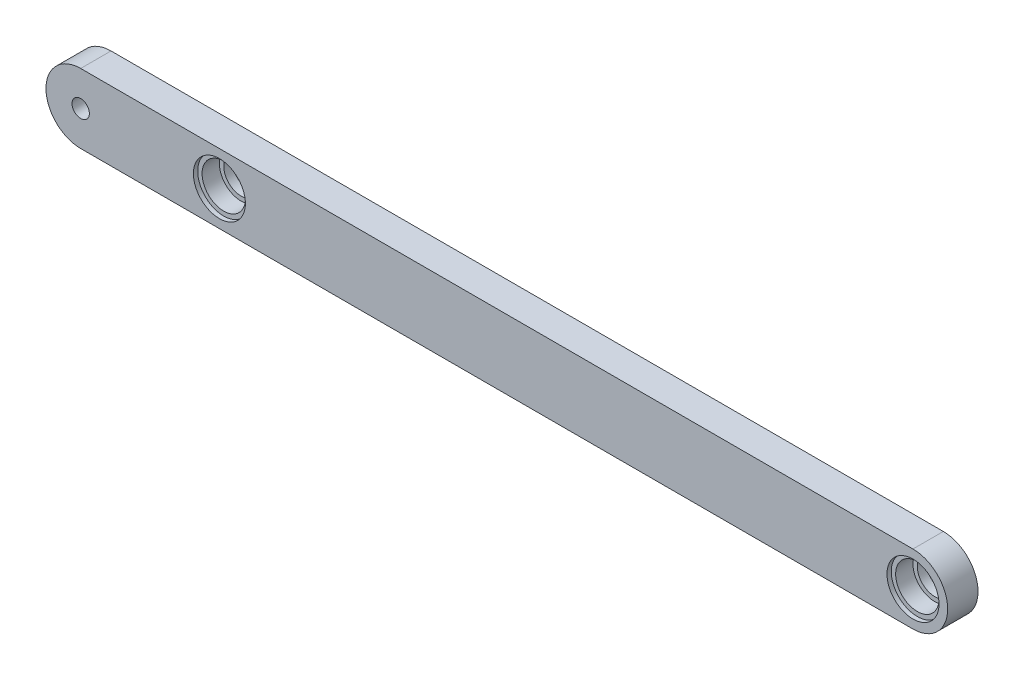
ISO-10303-21;
HEADER;
FILE_DESCRIPTION(('STEP AP214'),'2;1');
FILE_NAME('part.step','',(''),(''),'','','');
FILE_SCHEMA(('AUTOMOTIVE_DESIGN { 1 0 10303 214 1 1 1 1 }'));
ENDSEC;
DATA;
#1=APPLICATION_CONTEXT('core data for automotive mechanical design processes');
#2=APPLICATION_PROTOCOL_DEFINITION('international standard','automotive_design',2000,#1);
#3=PRODUCT_CONTEXT('',#1,'mechanical');
#4=PRODUCT('Part','Part','',(#3));
#5=PRODUCT_RELATED_PRODUCT_CATEGORY('part','',(#4));
#6=PRODUCT_DEFINITION_FORMATION('','',#4);
#7=PRODUCT_DEFINITION_CONTEXT('part definition',#1,'design');
#8=PRODUCT_DEFINITION('design','',#6,#7);
#9=PRODUCT_DEFINITION_SHAPE('','',#8);
#10=(LENGTH_UNIT() NAMED_UNIT(*) SI_UNIT(.MILLI.,.METRE.));
#11=(NAMED_UNIT(*) PLANE_ANGLE_UNIT() SI_UNIT($,.RADIAN.));
#12=(NAMED_UNIT(*) SI_UNIT($,.STERADIAN.) SOLID_ANGLE_UNIT());
#13=UNCERTAINTY_MEASURE_WITH_UNIT(LENGTH_MEASURE(1.E-05),#10,'distance_accuracy_value','');
#14=(GEOMETRIC_REPRESENTATION_CONTEXT(3) GLOBAL_UNCERTAINTY_ASSIGNED_CONTEXT((#13)) GLOBAL_UNIT_ASSIGNED_CONTEXT((#10,
#11,#12)) REPRESENTATION_CONTEXT('',''));
#15=CARTESIAN_POINT('',(0.,0.,0.));
#16=DIRECTION('',(0.,0.,1.));
#17=DIRECTION('',(1.,0.,0.));
#18=AXIS2_PLACEMENT_3D('',#15,#16,#17);
#19=CARTESIAN_POINT('',(0.,4.,3.5));
#20=DIRECTION('',(0.,-1.,0.));
#21=DIRECTION('',(1.,0.,0.));
#22=AXIS2_PLACEMENT_3D('',#19,#20,#21);
#23=PLANE('',#22);
#24=DIRECTION('',(0.,0.,1.));
#25=VECTOR('',#24,1.);
#26=CARTESIAN_POINT('',(3.99999999999999,4.00000000000001,0.));
#27=LINE('',#26,#25);
#28=CARTESIAN_POINT('',(3.99999999999999,4.,0.));
#29=VERTEX_POINT('',#28);
#30=CARTESIAN_POINT('',(3.99999999999999,4.00000000000001,3.5));
#31=VERTEX_POINT('',#30);
#32=EDGE_CURVE('E48',#29,#31,#27,.T.);
#33=ORIENTED_EDGE('',*,*,#32,.T.);
#34=DIRECTION('',(-1.,0.,0.));
#35=VECTOR('',#34,1.);
#36=CARTESIAN_POINT('',(0.,4.,3.5));
#37=LINE('',#36,#35);
#38=CARTESIAN_POINT('',(100.,4.00000000000001,3.5));
#39=VERTEX_POINT('',#38);
#40=EDGE_CURVE('E82',#39,#31,#37,.T.);
#41=ORIENTED_EDGE('',*,*,#40,.F.);
#42=DIRECTION('',(0.,0.,-1.));
#43=VECTOR('',#42,1.);
#44=CARTESIAN_POINT('',(100.,4.00000000000001,3.5));
#45=LINE('',#44,#43);
#46=CARTESIAN_POINT('',(100.,4.00000000000001,0.));
#47=VERTEX_POINT('',#46);
#48=EDGE_CURVE('E41',#39,#47,#45,.T.);
#49=ORIENTED_EDGE('',*,*,#48,.T.);
#50=DIRECTION('',(-1.,0.,0.));
#51=VECTOR('',#50,1.);
#52=CARTESIAN_POINT('',(0.,4.,0.));
#53=LINE('',#52,#51);
#54=EDGE_CURVE('E77',#47,#29,#53,.T.);
#55=ORIENTED_EDGE('',*,*,#54,.T.);
#56=EDGE_LOOP('',(#33,#41,#49,#55));
#57=FACE_BOUND('',#56,.T.);
#58=ADVANCED_FACE('F33',(#57),#23,.F.);
#59=CARTESIAN_POINT('',(20.,0.,1.));
#60=DIRECTION('',(0.,0.,1.));
#61=DIRECTION('',(1.,0.,0.));
#62=AXIS2_PLACEMENT_3D('',#59,#60,#61);
#63=CYLINDRICAL_SURFACE('',#62,2.5);
#64=CARTESIAN_POINT('',(20.,0.,1.));
#65=DIRECTION('',(0.,0.,1.));
#66=DIRECTION('',(1.,0.,0.));
#67=AXIS2_PLACEMENT_3D('',#64,#65,#66);
#68=CIRCLE('',#67,2.5);
#69=CARTESIAN_POINT('',(22.5,0.,1.));
#70=VERTEX_POINT('',#69);
#71=EDGE_CURVE('E116',#70,#70,#68,.T.);
#72=ORIENTED_EDGE('',*,*,#71,.F.);
#73=EDGE_LOOP('',(#72));
#74=FACE_BOUND('',#73,.T.);
#75=CARTESIAN_POINT('',(20.,0.,3.));
#76=DIRECTION('',(0.,0.,1.));
#77=DIRECTION('',(1.,0.,0.));
#78=AXIS2_PLACEMENT_3D('',#75,#76,#77);
#79=CIRCLE('',#78,2.5);
#80=CARTESIAN_POINT('',(22.5,0.,3.));
#81=VERTEX_POINT('',#80);
#82=EDGE_CURVE('E119',#81,#81,#79,.T.);
#83=ORIENTED_EDGE('',*,*,#82,.T.);
#84=EDGE_LOOP('',(#83));
#85=FACE_BOUND('',#84,.T.);
#86=ADVANCED_FACE('F173',(#74,#85),#63,.F.);
#87=CARTESIAN_POINT('',(20.,0.,0.));
#88=DIRECTION('',(0.,0.,1.));
#89=DIRECTION('',(1.,0.,0.));
#90=AXIS2_PLACEMENT_3D('',#87,#88,#89);
#91=CYLINDRICAL_SURFACE('',#90,2.);
#92=CARTESIAN_POINT('',(20.,0.,0.));
#93=DIRECTION('',(0.,0.,1.));
#94=DIRECTION('',(1.,0.,0.));
#95=AXIS2_PLACEMENT_3D('',#92,#93,#94);
#96=CIRCLE('',#95,2.);
#97=CARTESIAN_POINT('',(22.,0.,0.));
#98=VERTEX_POINT('',#97);
#99=EDGE_CURVE('E106',#98,#98,#96,.T.);
#100=ORIENTED_EDGE('',*,*,#99,.F.);
#101=EDGE_LOOP('',(#100));
#102=FACE_BOUND('',#101,.T.);
#103=CARTESIAN_POINT('',(20.,0.,1.));
#104=DIRECTION('',(0.,0.,1.));
#105=DIRECTION('',(1.,0.,0.));
#106=AXIS2_PLACEMENT_3D('',#103,#104,#105);
#107=CIRCLE('',#106,2.);
#108=CARTESIAN_POINT('',(22.,0.,1.));
#109=VERTEX_POINT('',#108);
#110=EDGE_CURVE('E113',#109,#109,#107,.T.);
#111=ORIENTED_EDGE('',*,*,#110,.T.);
#112=EDGE_LOOP('',(#111));
#113=FACE_BOUND('',#112,.T.);
#114=ADVANCED_FACE('F178',(#102,#113),#91,.F.);
#115=CARTESIAN_POINT('',(100.,0.,1.));
#116=DIRECTION('',(0.,0.,1.));
#117=DIRECTION('',(1.,0.,0.));
#118=AXIS2_PLACEMENT_3D('',#115,#116,#117);
#119=CYLINDRICAL_SURFACE('',#118,2.50000000000001);
#120=CARTESIAN_POINT('',(100.,0.,1.));
#121=DIRECTION('',(0.,0.,1.));
#122=DIRECTION('',(1.,0.,0.));
#123=AXIS2_PLACEMENT_3D('',#120,#121,#122);
#124=CIRCLE('',#123,2.50000000000001);
#125=CARTESIAN_POINT('',(102.5,0.,1.));
#126=VERTEX_POINT('',#125);
#127=EDGE_CURVE('E95',#126,#126,#124,.T.);
#128=ORIENTED_EDGE('',*,*,#127,.F.);
#129=EDGE_LOOP('',(#128));
#130=FACE_BOUND('',#129,.T.);
#131=CARTESIAN_POINT('',(100.,0.,3.));
#132=DIRECTION('',(0.,0.,1.));
#133=DIRECTION('',(1.,0.,0.));
#134=AXIS2_PLACEMENT_3D('',#131,#132,#133);
#135=CIRCLE('',#134,2.50000000000001);
#136=CARTESIAN_POINT('',(102.5,0.,3.));
#137=VERTEX_POINT('',#136);
#138=EDGE_CURVE('E105',#137,#137,#135,.T.);
#139=ORIENTED_EDGE('',*,*,#138,.T.);
#140=EDGE_LOOP('',(#139));
#141=FACE_BOUND('',#140,.T.);
#142=ADVANCED_FACE('F191',(#130,#141),#119,.F.);
#143=CARTESIAN_POINT('',(100.,0.,0.));
#144=DIRECTION('',(0.,0.,1.));
#145=DIRECTION('',(1.,0.,0.));
#146=AXIS2_PLACEMENT_3D('',#143,#144,#145);
#147=CYLINDRICAL_SURFACE('',#146,2.);
#148=CARTESIAN_POINT('',(100.,0.,0.));
#149=DIRECTION('',(0.,0.,1.));
#150=DIRECTION('',(1.,0.,0.));
#151=AXIS2_PLACEMENT_3D('',#148,#149,#150);
#152=CIRCLE('',#151,2.);
#153=CARTESIAN_POINT('',(102.,0.,0.));
#154=VERTEX_POINT('',#153);
#155=EDGE_CURVE('E90',#154,#154,#152,.T.);
#156=ORIENTED_EDGE('',*,*,#155,.F.);
#157=EDGE_LOOP('',(#156));
#158=FACE_BOUND('',#157,.T.);
#159=CARTESIAN_POINT('',(100.,0.,1.));
#160=DIRECTION('',(0.,0.,1.));
#161=DIRECTION('',(1.,0.,0.));
#162=AXIS2_PLACEMENT_3D('',#159,#160,#161);
#163=CIRCLE('',#162,2.);
#164=CARTESIAN_POINT('',(102.,0.,1.));
#165=VERTEX_POINT('',#164);
#166=EDGE_CURVE('E98',#165,#165,#163,.T.);
#167=ORIENTED_EDGE('',*,*,#166,.T.);
#168=EDGE_LOOP('',(#167));
#169=FACE_BOUND('',#168,.T.);
#170=ADVANCED_FACE('F186',(#158,#169),#147,.F.);
#171=CARTESIAN_POINT('',(0.,-4.,3.5));
#172=DIRECTION('',(0.,1.,0.));
#173=DIRECTION('',(-1.,0.,0.));
#174=AXIS2_PLACEMENT_3D('',#171,#172,#173);
#175=PLANE('',#174);
#176=DIRECTION('',(1.,0.,0.));
#177=VECTOR('',#176,1.);
#178=CARTESIAN_POINT('',(0.,-4.,3.5));
#179=LINE('',#178,#177);
#180=CARTESIAN_POINT('',(3.99999999999999,-4.00000000000001,3.5));
#181=VERTEX_POINT('',#180);
#182=CARTESIAN_POINT('',(100.,-4.00000000000001,3.5));
#183=VERTEX_POINT('',#182);
#184=EDGE_CURVE('E85',#181,#183,#179,.T.);
#185=ORIENTED_EDGE('',*,*,#184,.F.);
#186=DIRECTION('',(0.,0.,1.));
#187=VECTOR('',#186,1.);
#188=CARTESIAN_POINT('',(3.99999999999999,-4.00000000000001,0.));
#189=LINE('',#188,#187);
#190=CARTESIAN_POINT('',(3.99999999999999,-4.00000000000001,0.));
#191=VERTEX_POINT('',#190);
#192=EDGE_CURVE('E134',#191,#181,#189,.T.);
#193=ORIENTED_EDGE('',*,*,#192,.F.);
#194=DIRECTION('',(1.,0.,0.));
#195=VECTOR('',#194,1.);
#196=CARTESIAN_POINT('',(0.,-4.,0.));
#197=LINE('',#196,#195);
#198=CARTESIAN_POINT('',(100.,-4.00000000000001,0.));
#199=VERTEX_POINT('',#198);
#200=EDGE_CURVE('E78',#191,#199,#197,.T.);
#201=ORIENTED_EDGE('',*,*,#200,.T.);
#202=DIRECTION('',(0.,0.,-1.));
#203=VECTOR('',#202,1.);
#204=CARTESIAN_POINT('',(100.,-4.00000000000001,3.5));
#205=LINE('',#204,#203);
#206=EDGE_CURVE('E11',#183,#199,#205,.T.);
#207=ORIENTED_EDGE('',*,*,#206,.F.);
#208=EDGE_LOOP('',(#185,#193,#201,#207));
#209=FACE_BOUND('',#208,.T.);
#210=ADVANCED_FACE('F35',(#209),#175,.F.);
#211=CARTESIAN_POINT('',(100.,0.,3.5));
#212=DIRECTION('',(0.,0.,-1.));
#213=DIRECTION('',(-1.,0.,0.));
#214=AXIS2_PLACEMENT_3D('',#211,#212,#213);
#215=CYLINDRICAL_SURFACE('',#214,4.00000000000001);
#216=CARTESIAN_POINT('',(100.,0.,0.));
#217=DIRECTION('',(0.,0.,1.));
#218=DIRECTION('',(1.,0.,0.));
#219=AXIS2_PLACEMENT_3D('',#216,#217,#218);
#220=CIRCLE('',#219,4.00000000000001);
#221=EDGE_CURVE('E69',#199,#47,#220,.T.);
#222=ORIENTED_EDGE('',*,*,#221,.T.);
#223=ORIENTED_EDGE('',*,*,#48,.F.);
#224=CARTESIAN_POINT('',(100.,0.,3.5));
#225=DIRECTION('',(0.,0.,1.));
#226=DIRECTION('',(1.,0.,0.));
#227=AXIS2_PLACEMENT_3D('',#224,#225,#226);
#228=CIRCLE('',#227,4.00000000000001);
#229=EDGE_CURVE('E57',#183,#39,#228,.T.);
#230=ORIENTED_EDGE('',*,*,#229,.F.);
#231=ORIENTED_EDGE('',*,*,#206,.T.);
#232=EDGE_LOOP('',(#222,#223,#230,#231));
#233=FACE_BOUND('',#232,.T.);
#234=ADVANCED_FACE('F71',(#233),#215,.T.);
#235=CARTESIAN_POINT('',(0.,0.,3.5));
#236=DIRECTION('',(0.,0.,1.));
#237=DIRECTION('',(1.,0.,0.));
#238=AXIS2_PLACEMENT_3D('',#235,#236,#237);
#239=PLANE('',#238);
#240=CARTESIAN_POINT('',(3.99999999999999,0.,3.5));
#241=DIRECTION('',(0.,0.,-1.));
#242=DIRECTION('',(1.,0.,0.));
#243=AXIS2_PLACEMENT_3D('',#240,#241,#242);
#244=CIRCLE('',#243,4.00000000000001);
#245=EDGE_CURVE('E138',#181,#31,#244,.T.);
#246=ORIENTED_EDGE('',*,*,#245,.F.);
#247=ORIENTED_EDGE('',*,*,#184,.T.);
#248=ORIENTED_EDGE('',*,*,#229,.T.);
#249=ORIENTED_EDGE('',*,*,#40,.T.);
#250=EDGE_LOOP('',(#246,#247,#248,#249));
#251=FACE_BOUND('',#250,.T.);
#252=CARTESIAN_POINT('',(3.99999999999999,0.,3.5));
#253=DIRECTION('',(0.,0.,1.));
#254=DIRECTION('',(1.,0.,0.));
#255=AXIS2_PLACEMENT_3D('',#252,#253,#254);
#256=CIRCLE('',#255,1.);
#257=CARTESIAN_POINT('',(4.99999999999999,0.,3.5));
#258=VERTEX_POINT('',#257);
#259=EDGE_CURVE('E129',#258,#258,#256,.T.);
#260=ORIENTED_EDGE('',*,*,#259,.F.);
#261=EDGE_LOOP('',(#260));
#262=FACE_BOUND('',#261,.T.);
#263=CARTESIAN_POINT('',(20.,0.,3.5));
#264=DIRECTION('',(0.,0.,1.));
#265=DIRECTION('',(1.,0.,0.));
#266=AXIS2_PLACEMENT_3D('',#263,#264,#265);
#267=CIRCLE('',#266,3.);
#268=CARTESIAN_POINT('',(23.,0.,3.5));
#269=VERTEX_POINT('',#268);
#270=EDGE_CURVE('E120',#269,#269,#267,.T.);
#271=ORIENTED_EDGE('',*,*,#270,.F.);
#272=EDGE_LOOP('',(#271));
#273=FACE_BOUND('',#272,.T.);
#274=CARTESIAN_POINT('',(100.,0.,3.5));
#275=DIRECTION('',(0.,0.,1.));
#276=DIRECTION('',(1.,0.,0.));
#277=AXIS2_PLACEMENT_3D('',#274,#275,#276);
#278=CIRCLE('',#277,3.00000000000001);
#279=CARTESIAN_POINT('',(103.,0.,3.5));
#280=VERTEX_POINT('',#279);
#281=EDGE_CURVE('E102',#280,#280,#278,.T.);
#282=ORIENTED_EDGE('',*,*,#281,.F.);
#283=EDGE_LOOP('',(#282));
#284=FACE_BOUND('',#283,.T.);
#285=ADVANCED_FACE('F146',(#251,#262,#273,#284),#239,.T.);
#286=CARTESIAN_POINT('',(0.,0.,0.));
#287=DIRECTION('',(0.,0.,1.));
#288=DIRECTION('',(1.,0.,0.));
#289=AXIS2_PLACEMENT_3D('',#286,#287,#288);
#290=PLANE('',#289);
#291=CARTESIAN_POINT('',(3.99999999999999,0.,0.));
#292=DIRECTION('',(0.,0.,1.));
#293=DIRECTION('',(1.,0.,0.));
#294=AXIS2_PLACEMENT_3D('',#291,#292,#293);
#295=CIRCLE('',#294,1.);
#296=CARTESIAN_POINT('',(4.99999999999999,0.,0.));
#297=VERTEX_POINT('',#296);
#298=EDGE_CURVE('E124',#297,#297,#295,.T.);
#299=ORIENTED_EDGE('',*,*,#298,.T.);
#300=EDGE_LOOP('',(#299));
#301=FACE_BOUND('',#300,.T.);
#302=ORIENTED_EDGE('',*,*,#99,.T.);
#303=EDGE_LOOP('',(#302));
#304=FACE_BOUND('',#303,.T.);
#305=ORIENTED_EDGE('',*,*,#155,.T.);
#306=EDGE_LOOP('',(#305));
#307=FACE_BOUND('',#306,.T.);
#308=ORIENTED_EDGE('',*,*,#200,.F.);
#309=CARTESIAN_POINT('',(3.99999999999999,0.,0.));
#310=DIRECTION('',(0.,0.,-1.));
#311=DIRECTION('',(1.,0.,0.));
#312=AXIS2_PLACEMENT_3D('',#309,#310,#311);
#313=CIRCLE('',#312,4.00000000000001);
#314=EDGE_CURVE('E84',#191,#29,#313,.T.);
#315=ORIENTED_EDGE('',*,*,#314,.T.);
#316=ORIENTED_EDGE('',*,*,#54,.F.);
#317=ORIENTED_EDGE('',*,*,#221,.F.);
#318=EDGE_LOOP('',(#308,#315,#316,#317));
#319=FACE_BOUND('',#318,.T.);
#320=ADVANCED_FACE('F83',(#301,#304,#307,#319),#290,.F.);
#321=CARTESIAN_POINT('',(0.,0.,1.));
#322=DIRECTION('',(0.,0.,1.));
#323=DIRECTION('',(1.,0.,0.));
#324=AXIS2_PLACEMENT_3D('',#321,#322,#323);
#325=PLANE('',#324);
#326=ORIENTED_EDGE('',*,*,#166,.F.);
#327=EDGE_LOOP('',(#326));
#328=FACE_BOUND('',#327,.T.);
#329=ORIENTED_EDGE('',*,*,#127,.T.);
#330=EDGE_LOOP('',(#329));
#331=FACE_BOUND('',#330,.T.);
#332=ADVANCED_FACE('F159',(#328,#331),#325,.T.);
#333=CARTESIAN_POINT('',(100.,0.,3.));
#334=DIRECTION('',(0.,0.,1.));
#335=DIRECTION('',(1.,0.,0.));
#336=AXIS2_PLACEMENT_3D('',#333,#334,#335);
#337=CYLINDRICAL_SURFACE('',#336,3.00000000000001);
#338=CARTESIAN_POINT('',(100.,0.,3.));
#339=DIRECTION('',(0.,0.,1.));
#340=DIRECTION('',(1.,0.,0.));
#341=AXIS2_PLACEMENT_3D('',#338,#339,#340);
#342=CIRCLE('',#341,3.00000000000001);
#343=CARTESIAN_POINT('',(103.,0.,3.));
#344=VERTEX_POINT('',#343);
#345=EDGE_CURVE('E101',#344,#344,#342,.T.);
#346=ORIENTED_EDGE('',*,*,#345,.F.);
#347=EDGE_LOOP('',(#346));
#348=FACE_BOUND('',#347,.T.);
#349=ORIENTED_EDGE('',*,*,#281,.T.);
#350=EDGE_LOOP('',(#349));
#351=FACE_BOUND('',#350,.T.);
#352=ADVANCED_FACE('F156',(#348,#351),#337,.F.);
#353=CARTESIAN_POINT('',(0.,0.,3.));
#354=DIRECTION('',(0.,0.,1.));
#355=DIRECTION('',(1.,0.,0.));
#356=AXIS2_PLACEMENT_3D('',#353,#354,#355);
#357=PLANE('',#356);
#358=ORIENTED_EDGE('',*,*,#138,.F.);
#359=EDGE_LOOP('',(#358));
#360=FACE_BOUND('',#359,.T.);
#361=ORIENTED_EDGE('',*,*,#345,.T.);
#362=EDGE_LOOP('',(#361));
#363=FACE_BOUND('',#362,.T.);
#364=ADVANCED_FACE('F158',(#360,#363),#357,.T.);
#365=CARTESIAN_POINT('',(0.,0.,1.));
#366=DIRECTION('',(0.,0.,1.));
#367=DIRECTION('',(1.,0.,0.));
#368=AXIS2_PLACEMENT_3D('',#365,#366,#367);
#369=PLANE('',#368);
#370=ORIENTED_EDGE('',*,*,#71,.T.);
#371=EDGE_LOOP('',(#370));
#372=FACE_BOUND('',#371,.T.);
#373=ORIENTED_EDGE('',*,*,#110,.F.);
#374=EDGE_LOOP('',(#373));
#375=FACE_BOUND('',#374,.T.);
#376=ADVANCED_FACE('F166',(#372,#375),#369,.T.);
#377=CARTESIAN_POINT('',(20.,0.,3.));
#378=DIRECTION('',(0.,0.,1.));
#379=DIRECTION('',(1.,0.,0.));
#380=AXIS2_PLACEMENT_3D('',#377,#378,#379);
#381=CYLINDRICAL_SURFACE('',#380,3.);
#382=CARTESIAN_POINT('',(20.,0.,3.));
#383=DIRECTION('',(0.,0.,1.));
#384=DIRECTION('',(1.,0.,0.));
#385=AXIS2_PLACEMENT_3D('',#382,#383,#384);
#386=CIRCLE('',#385,3.);
#387=CARTESIAN_POINT('',(23.,0.,3.));
#388=VERTEX_POINT('',#387);
#389=EDGE_CURVE('E123',#388,#388,#386,.T.);
#390=ORIENTED_EDGE('',*,*,#389,.F.);
#391=EDGE_LOOP('',(#390));
#392=FACE_BOUND('',#391,.T.);
#393=ORIENTED_EDGE('',*,*,#270,.T.);
#394=EDGE_LOOP('',(#393));
#395=FACE_BOUND('',#394,.T.);
#396=ADVANCED_FACE('F224',(#392,#395),#381,.F.);
#397=CARTESIAN_POINT('',(0.,0.,3.));
#398=DIRECTION('',(0.,0.,1.));
#399=DIRECTION('',(1.,0.,0.));
#400=AXIS2_PLACEMENT_3D('',#397,#398,#399);
#401=PLANE('',#400);
#402=ORIENTED_EDGE('',*,*,#389,.T.);
#403=EDGE_LOOP('',(#402));
#404=FACE_BOUND('',#403,.T.);
#405=ORIENTED_EDGE('',*,*,#82,.F.);
#406=EDGE_LOOP('',(#405));
#407=FACE_BOUND('',#406,.T.);
#408=ADVANCED_FACE('F230',(#404,#407),#401,.T.);
#409=CARTESIAN_POINT('',(3.99999999999999,0.,0.));
#410=DIRECTION('',(0.,0.,1.));
#411=DIRECTION('',(1.,0.,0.));
#412=AXIS2_PLACEMENT_3D('',#409,#410,#411);
#413=CYLINDRICAL_SURFACE('',#412,1.);
#414=ORIENTED_EDGE('',*,*,#298,.F.);
#415=EDGE_LOOP('',(#414));
#416=FACE_BOUND('',#415,.T.);
#417=ORIENTED_EDGE('',*,*,#259,.T.);
#418=EDGE_LOOP('',(#417));
#419=FACE_BOUND('',#418,.T.);
#420=ADVANCED_FACE('F236',(#416,#419),#413,.F.);
#421=CARTESIAN_POINT('',(3.99999999999999,0.,0.));
#422=DIRECTION('',(0.,0.,1.));
#423=DIRECTION('',(1.,0.,0.));
#424=AXIS2_PLACEMENT_3D('',#421,#422,#423);
#425=CYLINDRICAL_SURFACE('',#424,4.00000000000001);
#426=ORIENTED_EDGE('',*,*,#245,.T.);
#427=ORIENTED_EDGE('',*,*,#32,.F.);
#428=ORIENTED_EDGE('',*,*,#314,.F.);
#429=ORIENTED_EDGE('',*,*,#192,.T.);
#430=EDGE_LOOP('',(#426,#427,#428,#429));
#431=FACE_BOUND('',#430,.T.);
#432=ADVANCED_FACE('F142',(#431),#425,.T.);
#433=CLOSED_SHELL('',(#58,#86,#114,#142,#170,#210,#234,#285,#320,#332,#352,#364,#376,#396,#408,
#420,#432));
#434=MANIFOLD_SOLID_BREP('B2',#433);
#435=ADVANCED_BREP_SHAPE_REPRESENTATION('',(#18,#434),#14);
#436=SHAPE_DEFINITION_REPRESENTATION(#9,#435);
ENDSEC;
END-ISO-10303-21;
